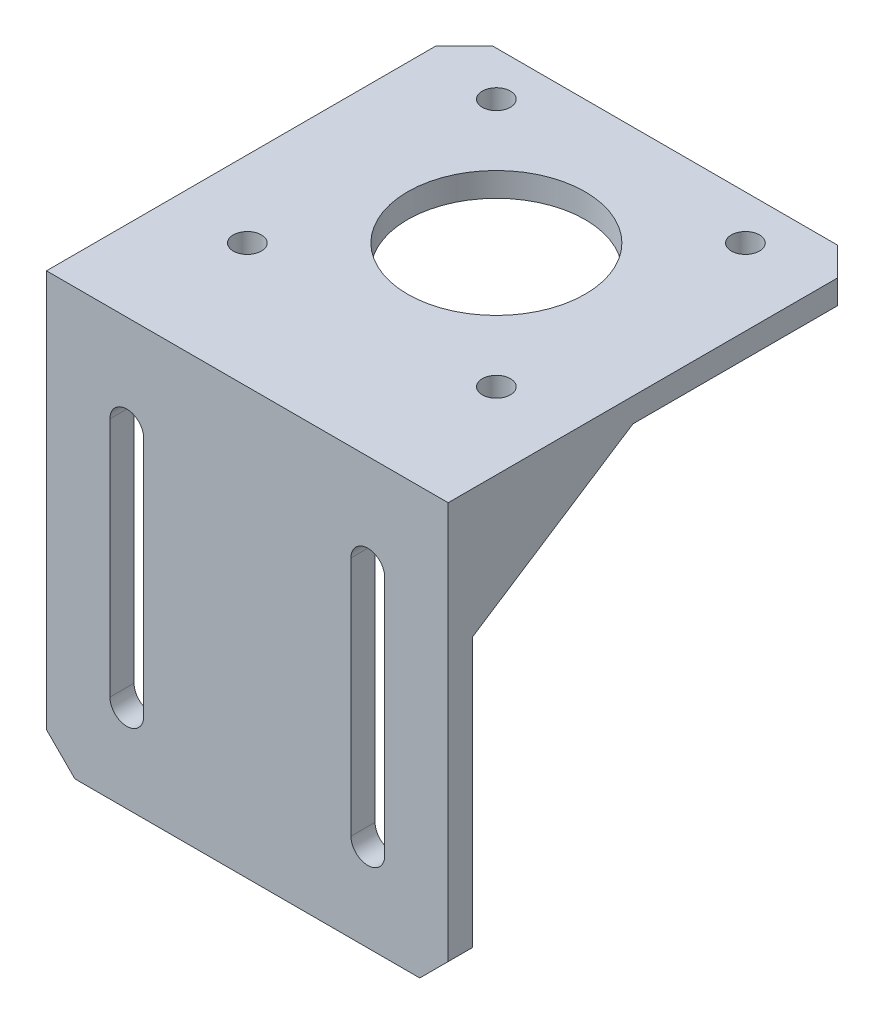
ISO-10303-21;
HEADER;
FILE_DESCRIPTION(('STEP AP214'),'2;1');
FILE_NAME('part.step','',(''),(''),'','','');
FILE_SCHEMA(('AUTOMOTIVE_DESIGN { 1 0 10303 214 1 1 1 1 }'));
ENDSEC;
DATA;
#1=APPLICATION_CONTEXT('core data for automotive mechanical design processes');
#2=APPLICATION_PROTOCOL_DEFINITION('international standard','automotive_design',2000,#1);
#3=PRODUCT_CONTEXT('',#1,'mechanical');
#4=PRODUCT('Part','Part','',(#3));
#5=PRODUCT_RELATED_PRODUCT_CATEGORY('part','',(#4));
#6=PRODUCT_DEFINITION_FORMATION('','',#4);
#7=PRODUCT_DEFINITION_CONTEXT('part definition',#1,'design');
#8=PRODUCT_DEFINITION('design','',#6,#7);
#9=PRODUCT_DEFINITION_SHAPE('','',#8);
#10=(LENGTH_UNIT() NAMED_UNIT(*) SI_UNIT(.MILLI.,.METRE.));
#11=(NAMED_UNIT(*) PLANE_ANGLE_UNIT() SI_UNIT($,.RADIAN.));
#12=(NAMED_UNIT(*) SI_UNIT($,.STERADIAN.) SOLID_ANGLE_UNIT());
#13=UNCERTAINTY_MEASURE_WITH_UNIT(LENGTH_MEASURE(1.E-05),#10,'distance_accuracy_value','');
#14=(GEOMETRIC_REPRESENTATION_CONTEXT(3) GLOBAL_UNCERTAINTY_ASSIGNED_CONTEXT((#13)) GLOBAL_UNIT_ASSIGNED_CONTEXT((#10,
#11,#12)) REPRESENTATION_CONTEXT('',''));
#15=CARTESIAN_POINT('',(0.,0.,0.));
#16=DIRECTION('',(0.,0.,1.));
#17=DIRECTION('',(1.,0.,0.));
#18=AXIS2_PLACEMENT_3D('',#15,#16,#17);
#19=CARTESIAN_POINT('',(0.,3.,0.));
#20=DIRECTION('',(0.,-1.,0.));
#21=DIRECTION('',(0.,0.,-1.));
#22=AXIS2_PLACEMENT_3D('',#19,#20,#21);
#23=PLANE('',#22);
#24=DIRECTION('',(0.,0.,1.));
#25=VECTOR('',#24,1.);
#26=CARTESIAN_POINT('',(0.,3.,0.));
#27=LINE('',#26,#25);
#28=CARTESIAN_POINT('',(0.,3.,-45.4644660940672));
#29=VERTEX_POINT('',#28);
#30=CARTESIAN_POINT('',(0.,3.,3.));
#31=VERTEX_POINT('',#30);
#32=EDGE_CURVE('E370',#29,#31,#27,.T.);
#33=ORIENTED_EDGE('',*,*,#32,.T.);
#34=DIRECTION('',(-1.,0.,0.));
#35=VECTOR('',#34,1.);
#36=CARTESIAN_POINT('',(50.,3.,3.));
#37=LINE('',#36,#35);
#38=CARTESIAN_POINT('',(50.,3.,3.));
#39=VERTEX_POINT('',#38);
#40=EDGE_CURVE('E296',#39,#31,#37,.T.);
#41=ORIENTED_EDGE('',*,*,#40,.F.);
#42=DIRECTION('',(0.,0.,-1.));
#43=VECTOR('',#42,1.);
#44=CARTESIAN_POINT('',(50.,3.,-45.4644660940672));
#45=LINE('',#44,#43);
#46=CARTESIAN_POINT('',(50.,3.,-45.4644660940672));
#47=VERTEX_POINT('',#46);
#48=EDGE_CURVE('E87',#39,#47,#45,.T.);
#49=ORIENTED_EDGE('',*,*,#48,.T.);
#50=DIRECTION('',(-0.707106781186547,0.,-0.707106781186547));
#51=VECTOR('',#50,1.);
#52=CARTESIAN_POINT('',(46.4644660940673,3.,-49.));
#53=LINE('',#52,#51);
#54=CARTESIAN_POINT('',(46.4644660940673,3.,-49.));
#55=VERTEX_POINT('',#54);
#56=EDGE_CURVE('E364',#47,#55,#53,.T.);
#57=ORIENTED_EDGE('',*,*,#56,.T.);
#58=DIRECTION('',(-1.,0.,0.));
#59=VECTOR('',#58,1.);
#60=CARTESIAN_POINT('',(3.53553390593273,3.,-49.));
#61=LINE('',#60,#59);
#62=CARTESIAN_POINT('',(3.53553390593273,3.,-49.));
#63=VERTEX_POINT('',#62);
#64=EDGE_CURVE('E367',#55,#63,#61,.T.);
#65=ORIENTED_EDGE('',*,*,#64,.T.);
#66=DIRECTION('',(-0.707106781186546,0.,0.707106781186549));
#67=VECTOR('',#66,1.);
#68=CARTESIAN_POINT('',(0.,3.,-45.4644660940672));
#69=LINE('',#68,#67);
#70=EDGE_CURVE('E59',#63,#29,#69,.T.);
#71=ORIENTED_EDGE('',*,*,#70,.T.);
#72=EDGE_LOOP('',(#33,#41,#49,#57,#65,#71));
#73=FACE_BOUND('',#72,.T.);
#74=CARTESIAN_POINT('',(25.,3.,-28.));
#75=DIRECTION('',(0.,1.,0.));
#76=DIRECTION('',(0.,0.,1.));
#77=AXIS2_PLACEMENT_3D('',#74,#75,#76);
#78=CIRCLE('',#77,11.05);
#79=CARTESIAN_POINT('',(25.,3.,-16.95));
#80=VERTEX_POINT('',#79);
#81=EDGE_CURVE('E357',#80,#80,#78,.T.);
#82=ORIENTED_EDGE('',*,*,#81,.F.);
#83=EDGE_LOOP('',(#82));
#84=FACE_BOUND('',#83,.T.);
#85=CARTESIAN_POINT('',(9.5,3.,-12.5));
#86=DIRECTION('',(0.,1.,0.));
#87=DIRECTION('',(0.,0.,1.));
#88=AXIS2_PLACEMENT_3D('',#85,#86,#87);
#89=CIRCLE('',#88,1.75);
#90=CARTESIAN_POINT('',(9.5,3.,-10.75));
#91=VERTEX_POINT('',#90);
#92=EDGE_CURVE('E351',#91,#91,#89,.T.);
#93=ORIENTED_EDGE('',*,*,#92,.F.);
#94=EDGE_LOOP('',(#93));
#95=FACE_BOUND('',#94,.T.);
#96=CARTESIAN_POINT('',(9.50000000000001,3.,-43.5));
#97=DIRECTION('',(0.,1.,0.));
#98=DIRECTION('',(0.,0.,1.));
#99=AXIS2_PLACEMENT_3D('',#96,#97,#98);
#100=CIRCLE('',#99,1.75);
#101=CARTESIAN_POINT('',(9.50000000000001,3.,-41.75));
#102=VERTEX_POINT('',#101);
#103=EDGE_CURVE('E345',#102,#102,#100,.T.);
#104=ORIENTED_EDGE('',*,*,#103,.F.);
#105=EDGE_LOOP('',(#104));
#106=FACE_BOUND('',#105,.T.);
#107=CARTESIAN_POINT('',(40.5,3.,-43.5));
#108=DIRECTION('',(0.,1.,0.));
#109=DIRECTION('',(0.,0.,1.));
#110=AXIS2_PLACEMENT_3D('',#107,#108,#109);
#111=CIRCLE('',#110,1.75);
#112=CARTESIAN_POINT('',(40.5,3.,-41.75));
#113=VERTEX_POINT('',#112);
#114=EDGE_CURVE('E339',#113,#113,#111,.T.);
#115=ORIENTED_EDGE('',*,*,#114,.F.);
#116=EDGE_LOOP('',(#115));
#117=FACE_BOUND('',#116,.T.);
#118=CARTESIAN_POINT('',(40.5,3.,-12.5));
#119=DIRECTION('',(0.,1.,0.));
#120=DIRECTION('',(0.,0.,1.));
#121=AXIS2_PLACEMENT_3D('',#118,#119,#120);
#122=CIRCLE('',#121,1.75);
#123=CARTESIAN_POINT('',(40.5,3.,-10.75));
#124=VERTEX_POINT('',#123);
#125=EDGE_CURVE('E333',#124,#124,#122,.T.);
#126=ORIENTED_EDGE('',*,*,#125,.F.);
#127=EDGE_LOOP('',(#126));
#128=FACE_BOUND('',#127,.T.);
#129=ADVANCED_FACE('F35',(#73,#84,#95,#106,#117,#128),#23,.F.);
#130=CARTESIAN_POINT('',(0.,0.,0.));
#131=DIRECTION('',(0.,-1.,0.));
#132=DIRECTION('',(0.,0.,-1.));
#133=AXIS2_PLACEMENT_3D('',#130,#131,#132);
#134=PLANE('',#133);
#135=DIRECTION('',(-1.,0.,0.));
#136=VECTOR('',#135,1.);
#137=CARTESIAN_POINT('',(3.,0.,-20.));
#138=LINE('',#137,#136);
#139=CARTESIAN_POINT('',(3.,0.,-20.));
#140=VERTEX_POINT('',#139);
#141=CARTESIAN_POINT('',(0.,0.,-20.));
#142=VERTEX_POINT('',#141);
#143=EDGE_CURVE('E207',#140,#142,#138,.T.);
#144=ORIENTED_EDGE('',*,*,#143,.T.);
#145=DIRECTION('',(0.,0.,1.));
#146=VECTOR('',#145,1.);
#147=CARTESIAN_POINT('',(0.,0.,0.));
#148=LINE('',#147,#146);
#149=CARTESIAN_POINT('',(0.,0.,-45.4644660940672));
#150=VERTEX_POINT('',#149);
#151=EDGE_CURVE('E365',#150,#142,#148,.T.);
#152=ORIENTED_EDGE('',*,*,#151,.F.);
#153=DIRECTION('',(-0.707106781186546,0.,0.707106781186549));
#154=VECTOR('',#153,1.);
#155=CARTESIAN_POINT('',(0.,0.,-45.4644660940672));
#156=LINE('',#155,#154);
#157=CARTESIAN_POINT('',(3.53553390593273,0.,-49.));
#158=VERTEX_POINT('',#157);
#159=EDGE_CURVE('E80',#158,#150,#156,.T.);
#160=ORIENTED_EDGE('',*,*,#159,.F.);
#161=DIRECTION('',(-1.,0.,0.));
#162=VECTOR('',#161,1.);
#163=CARTESIAN_POINT('',(3.53553390593273,0.,-49.));
#164=LINE('',#163,#162);
#165=CARTESIAN_POINT('',(46.4644660940673,0.,-49.));
#166=VERTEX_POINT('',#165);
#167=EDGE_CURVE('E378',#166,#158,#164,.T.);
#168=ORIENTED_EDGE('',*,*,#167,.F.);
#169=DIRECTION('',(-0.707106781186547,0.,-0.707106781186547));
#170=VECTOR('',#169,1.);
#171=CARTESIAN_POINT('',(46.4644660940673,0.,-49.));
#172=LINE('',#171,#170);
#173=CARTESIAN_POINT('',(50.,0.,-45.4644660940672));
#174=VERTEX_POINT('',#173);
#175=EDGE_CURVE('E376',#174,#166,#172,.T.);
#176=ORIENTED_EDGE('',*,*,#175,.F.);
#177=DIRECTION('',(0.,0.,-1.));
#178=VECTOR('',#177,1.);
#179=CARTESIAN_POINT('',(50.,0.,-45.4644660940672));
#180=LINE('',#179,#178);
#181=CARTESIAN_POINT('',(50.,0.,-20.));
#182=VERTEX_POINT('',#181);
#183=EDGE_CURVE('E374',#182,#174,#180,.T.);
#184=ORIENTED_EDGE('',*,*,#183,.F.);
#185=DIRECTION('',(1.,0.,0.));
#186=VECTOR('',#185,1.);
#187=CARTESIAN_POINT('',(47.,0.,-20.));
#188=LINE('',#187,#186);
#189=CARTESIAN_POINT('',(47.,0.,-20.));
#190=VERTEX_POINT('',#189);
#191=EDGE_CURVE('E230',#190,#182,#188,.T.);
#192=ORIENTED_EDGE('',*,*,#191,.F.);
#193=DIRECTION('',(0.,0.,1.));
#194=VECTOR('',#193,1.);
#195=CARTESIAN_POINT('',(47.,0.,-20.));
#196=LINE('',#195,#194);
#197=CARTESIAN_POINT('',(47.,0.,0.));
#198=VERTEX_POINT('',#197);
#199=EDGE_CURVE('E218',#190,#198,#196,.T.);
#200=ORIENTED_EDGE('',*,*,#199,.T.);
#201=DIRECTION('',(1.,0.,0.));
#202=VECTOR('',#201,1.);
#203=CARTESIAN_POINT('',(50.,0.,0.));
#204=LINE('',#203,#202);
#205=CARTESIAN_POINT('',(3.,0.,0.));
#206=VERTEX_POINT('',#205);
#207=EDGE_CURVE('E360',#206,#198,#204,.T.);
#208=ORIENTED_EDGE('',*,*,#207,.F.);
#209=DIRECTION('',(0.,0.,-1.));
#210=VECTOR('',#209,1.);
#211=CARTESIAN_POINT('',(3.,0.,-20.));
#212=LINE('',#211,#210);
#213=EDGE_CURVE('E197',#206,#140,#212,.T.);
#214=ORIENTED_EDGE('',*,*,#213,.T.);
#215=EDGE_LOOP('',(#144,#152,#160,#168,#176,#184,#192,#200,#208,#214));
#216=FACE_BOUND('',#215,.T.);
#217=CARTESIAN_POINT('',(40.5,0.,-43.5));
#218=DIRECTION('',(0.,1.,0.));
#219=DIRECTION('',(0.,0.,1.));
#220=AXIS2_PLACEMENT_3D('',#217,#218,#219);
#221=CIRCLE('',#220,1.75);
#222=CARTESIAN_POINT('',(40.5,0.,-41.75));
#223=VERTEX_POINT('',#222);
#224=EDGE_CURVE('E336',#223,#223,#221,.T.);
#225=ORIENTED_EDGE('',*,*,#224,.T.);
#226=EDGE_LOOP('',(#225));
#227=FACE_BOUND('',#226,.T.);
#228=CARTESIAN_POINT('',(9.5,0.,-12.5));
#229=DIRECTION('',(0.,1.,0.));
#230=DIRECTION('',(0.,0.,1.));
#231=AXIS2_PLACEMENT_3D('',#228,#229,#230);
#232=CIRCLE('',#231,1.75);
#233=CARTESIAN_POINT('',(9.5,0.,-10.75));
#234=VERTEX_POINT('',#233);
#235=EDGE_CURVE('E348',#234,#234,#232,.T.);
#236=ORIENTED_EDGE('',*,*,#235,.T.);
#237=EDGE_LOOP('',(#236));
#238=FACE_BOUND('',#237,.T.);
#239=CARTESIAN_POINT('',(25.,0.,-28.));
#240=DIRECTION('',(0.,1.,0.));
#241=DIRECTION('',(0.,0.,1.));
#242=AXIS2_PLACEMENT_3D('',#239,#240,#241);
#243=CIRCLE('',#242,11.05);
#244=CARTESIAN_POINT('',(25.,0.,-16.95));
#245=VERTEX_POINT('',#244);
#246=EDGE_CURVE('E354',#245,#245,#243,.T.);
#247=ORIENTED_EDGE('',*,*,#246,.T.);
#248=EDGE_LOOP('',(#247));
#249=FACE_BOUND('',#248,.T.);
#250=CARTESIAN_POINT('',(9.50000000000001,0.,-43.5));
#251=DIRECTION('',(0.,1.,0.));
#252=DIRECTION('',(0.,0.,1.));
#253=AXIS2_PLACEMENT_3D('',#250,#251,#252);
#254=CIRCLE('',#253,1.75);
#255=CARTESIAN_POINT('',(9.50000000000001,0.,-41.75));
#256=VERTEX_POINT('',#255);
#257=EDGE_CURVE('E342',#256,#256,#254,.T.);
#258=ORIENTED_EDGE('',*,*,#257,.T.);
#259=EDGE_LOOP('',(#258));
#260=FACE_BOUND('',#259,.T.);
#261=CARTESIAN_POINT('',(40.5,0.,-12.5));
#262=DIRECTION('',(0.,1.,0.));
#263=DIRECTION('',(0.,0.,1.));
#264=AXIS2_PLACEMENT_3D('',#261,#262,#263);
#265=CIRCLE('',#264,1.75);
#266=CARTESIAN_POINT('',(40.5,0.,-10.75));
#267=VERTEX_POINT('',#266);
#268=EDGE_CURVE('E332',#267,#267,#265,.T.);
#269=ORIENTED_EDGE('',*,*,#268,.T.);
#270=EDGE_LOOP('',(#269));
#271=FACE_BOUND('',#270,.T.);
#272=ADVANCED_FACE('F395',(#216,#227,#238,#249,#260,#271),#134,.T.);
#273=CARTESIAN_POINT('',(50.,3.,-45.4644660940672));
#274=DIRECTION('',(-1.,0.,0.));
#275=DIRECTION('',(0.,0.,1.));
#276=AXIS2_PLACEMENT_3D('',#273,#274,#275);
#277=PLANE('',#276);
#278=DIRECTION('',(0.,0.544988350595414,-0.838443616300637));
#279=VECTOR('',#278,1.);
#280=CARTESIAN_POINT('',(50.,-13.,0.));
#281=LINE('',#280,#279);
#282=CARTESIAN_POINT('',(50.,-13.,0.));
#283=VERTEX_POINT('',#282);
#284=EDGE_CURVE('E213',#283,#182,#281,.T.);
#285=ORIENTED_EDGE('',*,*,#284,.T.);
#286=ORIENTED_EDGE('',*,*,#183,.T.);
#287=DIRECTION('',(0.,-1.,0.));
#288=VECTOR('',#287,1.);
#289=CARTESIAN_POINT('',(50.,3.,-45.4644660940672));
#290=LINE('',#289,#288);
#291=EDGE_CURVE('E11',#47,#174,#290,.T.);
#292=ORIENTED_EDGE('',*,*,#291,.F.);
#293=ORIENTED_EDGE('',*,*,#48,.F.);
#294=DIRECTION('',(0.,1.,0.));
#295=VECTOR('',#294,1.);
#296=CARTESIAN_POINT('',(50.,-46.4644660940673,3.));
#297=LINE('',#296,#295);
#298=CARTESIAN_POINT('',(50.,-46.4644660940673,3.));
#299=VERTEX_POINT('',#298);
#300=EDGE_CURVE('E308',#299,#39,#297,.T.);
#301=ORIENTED_EDGE('',*,*,#300,.F.);
#302=DIRECTION('',(0.,0.,-1.));
#303=VECTOR('',#302,1.);
#304=CARTESIAN_POINT('',(50.,-46.4644660940673,3.));
#305=LINE('',#304,#303);
#306=CARTESIAN_POINT('',(50.,-46.4644660940673,0.));
#307=VERTEX_POINT('',#306);
#308=EDGE_CURVE('E311',#299,#307,#305,.T.);
#309=ORIENTED_EDGE('',*,*,#308,.T.);
#310=DIRECTION('',(0.,1.,0.));
#311=VECTOR('',#310,1.);
#312=CARTESIAN_POINT('',(50.,-46.4644660940673,0.));
#313=LINE('',#312,#311);
#314=EDGE_CURVE('E300',#307,#283,#313,.T.);
#315=ORIENTED_EDGE('',*,*,#314,.T.);
#316=EDGE_LOOP('',(#285,#286,#292,#293,#301,#309,#315));
#317=FACE_BOUND('',#316,.T.);
#318=ADVANCED_FACE('F37',(#317),#277,.F.);
#319=CARTESIAN_POINT('',(46.4644660940673,3.,-49.));
#320=DIRECTION('',(-0.707106781186548,0.,0.707106781186548));
#321=DIRECTION('',(0.707106781186548,0.,0.707106781186548));
#322=AXIS2_PLACEMENT_3D('',#319,#320,#321);
#323=PLANE('',#322);
#324=ORIENTED_EDGE('',*,*,#175,.T.);
#325=DIRECTION('',(0.,-1.,0.));
#326=VECTOR('',#325,1.);
#327=CARTESIAN_POINT('',(46.4644660940673,3.,-49.));
#328=LINE('',#327,#326);
#329=EDGE_CURVE('E43',#55,#166,#328,.T.);
#330=ORIENTED_EDGE('',*,*,#329,.F.);
#331=ORIENTED_EDGE('',*,*,#56,.F.);
#332=ORIENTED_EDGE('',*,*,#291,.T.);
#333=EDGE_LOOP('',(#324,#330,#331,#332));
#334=FACE_BOUND('',#333,.T.);
#335=ADVANCED_FACE('F411',(#334),#323,.F.);
#336=CARTESIAN_POINT('',(3.53553390593273,3.,-49.));
#337=DIRECTION('',(0.,0.,1.));
#338=DIRECTION('',(1.,0.,0.));
#339=AXIS2_PLACEMENT_3D('',#336,#337,#338);
#340=PLANE('',#339);
#341=ORIENTED_EDGE('',*,*,#167,.T.);
#342=DIRECTION('',(0.,-1.,0.));
#343=VECTOR('',#342,1.);
#344=CARTESIAN_POINT('',(3.53553390593273,3.,-49.));
#345=LINE('',#344,#343);
#346=EDGE_CURVE('E383',#63,#158,#345,.T.);
#347=ORIENTED_EDGE('',*,*,#346,.F.);
#348=ORIENTED_EDGE('',*,*,#64,.F.);
#349=ORIENTED_EDGE('',*,*,#329,.T.);
#350=EDGE_LOOP('',(#341,#347,#348,#349));
#351=FACE_BOUND('',#350,.T.);
#352=ADVANCED_FACE('F389',(#351),#340,.F.);
#353=CARTESIAN_POINT('',(0.,3.,-45.4644660940672));
#354=DIRECTION('',(0.707106781186549,0.,0.707106781186546));
#355=DIRECTION('',(0.707106781186546,0.,-0.707106781186549));
#356=AXIS2_PLACEMENT_3D('',#353,#354,#355);
#357=PLANE('',#356);
#358=ORIENTED_EDGE('',*,*,#159,.T.);
#359=DIRECTION('',(0.,-1.,0.));
#360=VECTOR('',#359,1.);
#361=CARTESIAN_POINT('',(0.,3.,-45.4644660940672));
#362=LINE('',#361,#360);
#363=EDGE_CURVE('E372',#29,#150,#362,.T.);
#364=ORIENTED_EDGE('',*,*,#363,.F.);
#365=ORIENTED_EDGE('',*,*,#70,.F.);
#366=ORIENTED_EDGE('',*,*,#346,.T.);
#367=EDGE_LOOP('',(#358,#364,#365,#366));
#368=FACE_BOUND('',#367,.T.);
#369=ADVANCED_FACE('F402',(#368),#357,.F.);
#370=CARTESIAN_POINT('',(0.,3.,0.));
#371=DIRECTION('',(1.,0.,0.));
#372=DIRECTION('',(0.,0.,-1.));
#373=AXIS2_PLACEMENT_3D('',#370,#371,#372);
#374=PLANE('',#373);
#375=ORIENTED_EDGE('',*,*,#151,.T.);
#376=DIRECTION('',(0.,-0.544988350595414,0.838443616300637));
#377=VECTOR('',#376,1.);
#378=CARTESIAN_POINT('',(0.,-13.,0.));
#379=LINE('',#378,#377);
#380=CARTESIAN_POINT('',(0.,-13.,0.));
#381=VERTEX_POINT('',#380);
#382=EDGE_CURVE('E50',#142,#381,#379,.T.);
#383=ORIENTED_EDGE('',*,*,#382,.T.);
#384=DIRECTION('',(0.,-1.,0.));
#385=VECTOR('',#384,1.);
#386=CARTESIAN_POINT('',(0.,3.,0.));
#387=LINE('',#386,#385);
#388=CARTESIAN_POINT('',(0.,-46.4644660940673,0.));
#389=VERTEX_POINT('',#388);
#390=EDGE_CURVE('E211',#381,#389,#387,.T.);
#391=ORIENTED_EDGE('',*,*,#390,.T.);
#392=DIRECTION('',(0.,0.,-1.));
#393=VECTOR('',#392,1.);
#394=CARTESIAN_POINT('',(0.,-46.4644660940673,3.));
#395=LINE('',#394,#393);
#396=CARTESIAN_POINT('',(0.,-46.4644660940673,3.));
#397=VERTEX_POINT('',#396);
#398=EDGE_CURVE('E329',#397,#389,#395,.T.);
#399=ORIENTED_EDGE('',*,*,#398,.F.);
#400=DIRECTION('',(0.,-1.,0.));
#401=VECTOR('',#400,1.);
#402=CARTESIAN_POINT('',(0.,3.,3.));
#403=LINE('',#402,#401);
#404=EDGE_CURVE('E299',#31,#397,#403,.T.);
#405=ORIENTED_EDGE('',*,*,#404,.F.);
#406=ORIENTED_EDGE('',*,*,#32,.F.);
#407=ORIENTED_EDGE('',*,*,#363,.T.);
#408=EDGE_LOOP('',(#375,#383,#391,#399,#405,#406,#407));
#409=FACE_BOUND('',#408,.T.);
#410=ADVANCED_FACE('F399',(#409),#374,.F.);
#411=CARTESIAN_POINT('',(25.,3.,-28.));
#412=DIRECTION('',(0.,-1.,0.));
#413=DIRECTION('',(0.,0.,-1.));
#414=AXIS2_PLACEMENT_3D('',#411,#412,#413);
#415=CYLINDRICAL_SURFACE('',#414,11.05);
#416=ORIENTED_EDGE('',*,*,#81,.T.);
#417=EDGE_LOOP('',(#416));
#418=FACE_BOUND('',#417,.T.);
#419=ORIENTED_EDGE('',*,*,#246,.F.);
#420=EDGE_LOOP('',(#419));
#421=FACE_BOUND('',#420,.T.);
#422=ADVANCED_FACE('F409',(#418,#421),#415,.F.);
#423=CARTESIAN_POINT('',(9.5,3.,-12.5));
#424=DIRECTION('',(0.,-1.,0.));
#425=DIRECTION('',(0.,0.,-1.));
#426=AXIS2_PLACEMENT_3D('',#423,#424,#425);
#427=CYLINDRICAL_SURFACE('',#426,1.75);
#428=ORIENTED_EDGE('',*,*,#92,.T.);
#429=EDGE_LOOP('',(#428));
#430=FACE_BOUND('',#429,.T.);
#431=ORIENTED_EDGE('',*,*,#235,.F.);
#432=EDGE_LOOP('',(#431));
#433=FACE_BOUND('',#432,.T.);
#434=ADVANCED_FACE('F423',(#430,#433),#427,.F.);
#435=CARTESIAN_POINT('',(9.50000000000001,3.,-43.5));
#436=DIRECTION('',(0.,-1.,0.));
#437=DIRECTION('',(0.,0.,-1.));
#438=AXIS2_PLACEMENT_3D('',#435,#436,#437);
#439=CYLINDRICAL_SURFACE('',#438,1.75);
#440=ORIENTED_EDGE('',*,*,#103,.T.);
#441=EDGE_LOOP('',(#440));
#442=FACE_BOUND('',#441,.T.);
#443=ORIENTED_EDGE('',*,*,#257,.F.);
#444=EDGE_LOOP('',(#443));
#445=FACE_BOUND('',#444,.T.);
#446=ADVANCED_FACE('F427',(#442,#445),#439,.F.);
#447=CARTESIAN_POINT('',(40.5,3.,-43.5));
#448=DIRECTION('',(0.,-1.,0.));
#449=DIRECTION('',(0.,0.,-1.));
#450=AXIS2_PLACEMENT_3D('',#447,#448,#449);
#451=CYLINDRICAL_SURFACE('',#450,1.75);
#452=ORIENTED_EDGE('',*,*,#114,.T.);
#453=EDGE_LOOP('',(#452));
#454=FACE_BOUND('',#453,.T.);
#455=ORIENTED_EDGE('',*,*,#224,.F.);
#456=EDGE_LOOP('',(#455));
#457=FACE_BOUND('',#456,.T.);
#458=ADVANCED_FACE('F431',(#454,#457),#451,.F.);
#459=CARTESIAN_POINT('',(40.5,3.,-12.5));
#460=DIRECTION('',(0.,-1.,0.));
#461=DIRECTION('',(0.,0.,-1.));
#462=AXIS2_PLACEMENT_3D('',#459,#460,#461);
#463=CYLINDRICAL_SURFACE('',#462,1.75);
#464=ORIENTED_EDGE('',*,*,#125,.T.);
#465=EDGE_LOOP('',(#464));
#466=FACE_BOUND('',#465,.T.);
#467=ORIENTED_EDGE('',*,*,#268,.F.);
#468=EDGE_LOOP('',(#467));
#469=FACE_BOUND('',#468,.T.);
#470=ADVANCED_FACE('F435',(#466,#469),#463,.F.);
#471=CARTESIAN_POINT('',(0.,0.,0.));
#472=DIRECTION('',(0.,0.,1.));
#473=DIRECTION('',(1.,0.,0.));
#474=AXIS2_PLACEMENT_3D('',#471,#472,#473);
#475=PLANE('',#474);
#476=CARTESIAN_POINT('',(10.,-9.00000000000001,0.));
#477=DIRECTION('',(0.,0.,1.));
#478=DIRECTION('',(1.,0.,0.));
#479=AXIS2_PLACEMENT_3D('',#476,#477,#478);
#480=CIRCLE('',#479,2.09999999999999);
#481=CARTESIAN_POINT('',(12.1,-9.00000000000001,0.));
#482=VERTEX_POINT('',#481);
#483=CARTESIAN_POINT('',(7.90000000000001,-9.00000000000001,0.));
#484=VERTEX_POINT('',#483);
#485=EDGE_CURVE('E265',#482,#484,#480,.T.);
#486=ORIENTED_EDGE('',*,*,#485,.T.);
#487=DIRECTION('',(0.,-1.,0.));
#488=VECTOR('',#487,1.);
#489=CARTESIAN_POINT('',(7.90000000000001,-9.00000000000001,0.));
#490=LINE('',#489,#488);
#491=CARTESIAN_POINT('',(7.90000000000001,-39.,0.));
#492=VERTEX_POINT('',#491);
#493=EDGE_CURVE('E279',#484,#492,#490,.T.);
#494=ORIENTED_EDGE('',*,*,#493,.T.);
#495=CARTESIAN_POINT('',(10.,-39.,0.));
#496=DIRECTION('',(0.,0.,1.));
#497=DIRECTION('',(1.,0.,0.));
#498=AXIS2_PLACEMENT_3D('',#495,#496,#497);
#499=CIRCLE('',#498,2.09999999999999);
#500=CARTESIAN_POINT('',(12.1,-39.,0.));
#501=VERTEX_POINT('',#500);
#502=EDGE_CURVE('E282',#492,#501,#499,.T.);
#503=ORIENTED_EDGE('',*,*,#502,.T.);
#504=DIRECTION('',(0.,1.,0.));
#505=VECTOR('',#504,1.);
#506=CARTESIAN_POINT('',(12.1,-9.00000000000001,0.));
#507=LINE('',#506,#505);
#508=EDGE_CURVE('E269',#501,#482,#507,.T.);
#509=ORIENTED_EDGE('',*,*,#508,.T.);
#510=EDGE_LOOP('',(#486,#494,#503,#509));
#511=FACE_BOUND('',#510,.T.);
#512=CARTESIAN_POINT('',(40.,-9.00000000000001,0.));
#513=DIRECTION('',(0.,0.,1.));
#514=DIRECTION('',(-1.,0.,0.));
#515=AXIS2_PLACEMENT_3D('',#512,#513,#514);
#516=CIRCLE('',#515,2.09999999999999);
#517=CARTESIAN_POINT('',(42.1,-9.00000000000001,0.));
#518=VERTEX_POINT('',#517);
#519=CARTESIAN_POINT('',(37.9,-9.00000000000001,0.));
#520=VERTEX_POINT('',#519);
#521=EDGE_CURVE('E232',#518,#520,#516,.T.);
#522=ORIENTED_EDGE('',*,*,#521,.T.);
#523=DIRECTION('',(0.,-1.,0.));
#524=VECTOR('',#523,1.);
#525=CARTESIAN_POINT('',(37.9,-9.00000000000001,0.));
#526=LINE('',#525,#524);
#527=CARTESIAN_POINT('',(37.9,-39.,0.));
#528=VERTEX_POINT('',#527);
#529=EDGE_CURVE('E248',#520,#528,#526,.T.);
#530=ORIENTED_EDGE('',*,*,#529,.T.);
#531=CARTESIAN_POINT('',(40.,-39.,0.));
#532=DIRECTION('',(0.,0.,1.));
#533=DIRECTION('',(-1.,0.,0.));
#534=AXIS2_PLACEMENT_3D('',#531,#532,#533);
#535=CIRCLE('',#534,2.09999999999999);
#536=CARTESIAN_POINT('',(42.1,-39.,0.));
#537=VERTEX_POINT('',#536);
#538=EDGE_CURVE('E251',#528,#537,#535,.T.);
#539=ORIENTED_EDGE('',*,*,#538,.T.);
#540=DIRECTION('',(0.,1.,0.));
#541=VECTOR('',#540,1.);
#542=CARTESIAN_POINT('',(42.1,-9.00000000000001,0.));
#543=LINE('',#542,#541);
#544=EDGE_CURVE('E238',#537,#518,#543,.T.);
#545=ORIENTED_EDGE('',*,*,#544,.T.);
#546=EDGE_LOOP('',(#522,#530,#539,#545));
#547=FACE_BOUND('',#546,.T.);
#548=ORIENTED_EDGE('',*,*,#390,.F.);
#549=DIRECTION('',(-1.,0.,0.));
#550=VECTOR('',#549,1.);
#551=CARTESIAN_POINT('',(3.,-13.,0.));
#552=LINE('',#551,#550);
#553=CARTESIAN_POINT('',(3.,-13.,0.));
#554=VERTEX_POINT('',#553);
#555=EDGE_CURVE('E204',#554,#381,#552,.T.);
#556=ORIENTED_EDGE('',*,*,#555,.F.);
#557=DIRECTION('',(0.,1.,0.));
#558=VECTOR('',#557,1.);
#559=CARTESIAN_POINT('',(3.,0.,0.));
#560=LINE('',#559,#558);
#561=EDGE_CURVE('E192',#554,#206,#560,.T.);
#562=ORIENTED_EDGE('',*,*,#561,.T.);
#563=ORIENTED_EDGE('',*,*,#207,.T.);
#564=DIRECTION('',(0.,-1.,0.));
#565=VECTOR('',#564,1.);
#566=CARTESIAN_POINT('',(47.,0.,0.));
#567=LINE('',#566,#565);
#568=CARTESIAN_POINT('',(47.,-13.,0.));
#569=VERTEX_POINT('',#568);
#570=EDGE_CURVE('E221',#198,#569,#567,.T.);
#571=ORIENTED_EDGE('',*,*,#570,.T.);
#572=DIRECTION('',(1.,0.,0.));
#573=VECTOR('',#572,1.);
#574=CARTESIAN_POINT('',(47.,-13.,0.));
#575=LINE('',#574,#573);
#576=EDGE_CURVE('E227',#569,#283,#575,.T.);
#577=ORIENTED_EDGE('',*,*,#576,.T.);
#578=ORIENTED_EDGE('',*,*,#314,.F.);
#579=DIRECTION('',(0.707106781186546,0.707106781186549,0.));
#580=VECTOR('',#579,1.);
#581=CARTESIAN_POINT('',(46.4644660940673,-50.,0.));
#582=LINE('',#581,#580);
#583=CARTESIAN_POINT('',(46.4644660940673,-50.,0.));
#584=VERTEX_POINT('',#583);
#585=EDGE_CURVE('E317',#584,#307,#582,.T.);
#586=ORIENTED_EDGE('',*,*,#585,.F.);
#587=DIRECTION('',(1.,0.,0.));
#588=VECTOR('',#587,1.);
#589=CARTESIAN_POINT('',(3.53553390593273,-50.,0.));
#590=LINE('',#589,#588);
#591=CARTESIAN_POINT('',(3.53553390593273,-50.,0.));
#592=VERTEX_POINT('',#591);
#593=EDGE_CURVE('E315',#592,#584,#590,.T.);
#594=ORIENTED_EDGE('',*,*,#593,.F.);
#595=DIRECTION('',(0.707106781186546,-0.707106781186549,0.));
#596=VECTOR('',#595,1.);
#597=CARTESIAN_POINT('',(0.,-46.4644660940673,0.));
#598=LINE('',#597,#596);
#599=EDGE_CURVE('E313',#389,#592,#598,.T.);
#600=ORIENTED_EDGE('',*,*,#599,.F.);
#601=EDGE_LOOP('',(#548,#556,#562,#563,#571,#577,#578,#586,#594,#600));
#602=FACE_BOUND('',#601,.T.);
#603=ADVANCED_FACE('F209',(#511,#547,#602),#475,.F.);
#604=CARTESIAN_POINT('',(0.,0.,3.));
#605=DIRECTION('',(0.,0.,1.));
#606=DIRECTION('',(1.,0.,0.));
#607=AXIS2_PLACEMENT_3D('',#604,#605,#606);
#608=PLANE('',#607);
#609=ORIENTED_EDGE('',*,*,#40,.T.);
#610=ORIENTED_EDGE('',*,*,#404,.T.);
#611=DIRECTION('',(0.707106781186546,-0.707106781186549,0.));
#612=VECTOR('',#611,1.);
#613=CARTESIAN_POINT('',(0.,-46.4644660940673,3.));
#614=LINE('',#613,#612);
#615=CARTESIAN_POINT('',(3.53553390593273,-50.,3.));
#616=VERTEX_POINT('',#615);
#617=EDGE_CURVE('E302',#397,#616,#614,.T.);
#618=ORIENTED_EDGE('',*,*,#617,.T.);
#619=DIRECTION('',(1.,0.,0.));
#620=VECTOR('',#619,1.);
#621=CARTESIAN_POINT('',(3.53553390593273,-50.,3.));
#622=LINE('',#621,#620);
#623=CARTESIAN_POINT('',(46.4644660940673,-50.,3.));
#624=VERTEX_POINT('',#623);
#625=EDGE_CURVE('E304',#616,#624,#622,.T.);
#626=ORIENTED_EDGE('',*,*,#625,.T.);
#627=DIRECTION('',(0.707106781186546,0.707106781186549,0.));
#628=VECTOR('',#627,1.);
#629=CARTESIAN_POINT('',(46.4644660940673,-50.,3.));
#630=LINE('',#629,#628);
#631=EDGE_CURVE('E306',#624,#299,#630,.T.);
#632=ORIENTED_EDGE('',*,*,#631,.T.);
#633=ORIENTED_EDGE('',*,*,#300,.T.);
#634=EDGE_LOOP('',(#609,#610,#618,#626,#632,#633));
#635=FACE_BOUND('',#634,.T.);
#636=DIRECTION('',(0.,-1.,0.));
#637=VECTOR('',#636,1.);
#638=CARTESIAN_POINT('',(7.90000000000001,-9.00000000000001,3.));
#639=LINE('',#638,#637);
#640=CARTESIAN_POINT('',(7.90000000000001,-9.00000000000001,3.));
#641=VERTEX_POINT('',#640);
#642=CARTESIAN_POINT('',(7.90000000000001,-39.,3.));
#643=VERTEX_POINT('',#642);
#644=EDGE_CURVE('E268',#641,#643,#639,.T.);
#645=ORIENTED_EDGE('',*,*,#644,.F.);
#646=CARTESIAN_POINT('',(10.,-9.00000000000001,3.));
#647=DIRECTION('',(0.,0.,1.));
#648=DIRECTION('',(1.,0.,0.));
#649=AXIS2_PLACEMENT_3D('',#646,#647,#648);
#650=CIRCLE('',#649,2.09999999999999);
#651=CARTESIAN_POINT('',(12.1,-9.00000000000001,3.));
#652=VERTEX_POINT('',#651);
#653=EDGE_CURVE('E266',#652,#641,#650,.T.);
#654=ORIENTED_EDGE('',*,*,#653,.F.);
#655=DIRECTION('',(0.,1.,0.));
#656=VECTOR('',#655,1.);
#657=CARTESIAN_POINT('',(12.1,-9.00000000000001,3.));
#658=LINE('',#657,#656);
#659=CARTESIAN_POINT('',(12.1,-39.,3.));
#660=VERTEX_POINT('',#659);
#661=EDGE_CURVE('E274',#660,#652,#658,.T.);
#662=ORIENTED_EDGE('',*,*,#661,.F.);
#663=CARTESIAN_POINT('',(10.,-39.,3.));
#664=DIRECTION('',(0.,0.,1.));
#665=DIRECTION('',(1.,0.,0.));
#666=AXIS2_PLACEMENT_3D('',#663,#664,#665);
#667=CIRCLE('',#666,2.09999999999999);
#668=EDGE_CURVE('E271',#643,#660,#667,.T.);
#669=ORIENTED_EDGE('',*,*,#668,.F.);
#670=EDGE_LOOP('',(#645,#654,#662,#669));
#671=FACE_BOUND('',#670,.T.);
#672=DIRECTION('',(0.,-1.,0.));
#673=VECTOR('',#672,1.);
#674=CARTESIAN_POINT('',(37.9,-9.00000000000001,3.));
#675=LINE('',#674,#673);
#676=CARTESIAN_POINT('',(37.9,-9.00000000000001,3.));
#677=VERTEX_POINT('',#676);
#678=CARTESIAN_POINT('',(37.9,-39.,3.));
#679=VERTEX_POINT('',#678);
#680=EDGE_CURVE('E237',#677,#679,#675,.T.);
#681=ORIENTED_EDGE('',*,*,#680,.F.);
#682=CARTESIAN_POINT('',(40.,-9.00000000000001,3.));
#683=DIRECTION('',(0.,0.,1.));
#684=DIRECTION('',(-1.,0.,0.));
#685=AXIS2_PLACEMENT_3D('',#682,#683,#684);
#686=CIRCLE('',#685,2.09999999999999);
#687=CARTESIAN_POINT('',(42.1,-9.00000000000001,3.));
#688=VERTEX_POINT('',#687);
#689=EDGE_CURVE('E235',#688,#677,#686,.T.);
#690=ORIENTED_EDGE('',*,*,#689,.F.);
#691=DIRECTION('',(0.,1.,0.));
#692=VECTOR('',#691,1.);
#693=CARTESIAN_POINT('',(42.1,-9.00000000000001,3.));
#694=LINE('',#693,#692);
#695=CARTESIAN_POINT('',(42.1,-39.,3.));
#696=VERTEX_POINT('',#695);
#697=EDGE_CURVE('E243',#696,#688,#694,.T.);
#698=ORIENTED_EDGE('',*,*,#697,.F.);
#699=CARTESIAN_POINT('',(40.,-39.,3.));
#700=DIRECTION('',(0.,0.,1.));
#701=DIRECTION('',(-1.,0.,0.));
#702=AXIS2_PLACEMENT_3D('',#699,#700,#701);
#703=CIRCLE('',#702,2.09999999999999);
#704=EDGE_CURVE('E240',#679,#696,#703,.T.);
#705=ORIENTED_EDGE('',*,*,#704,.F.);
#706=EDGE_LOOP('',(#681,#690,#698,#705));
#707=FACE_BOUND('',#706,.T.);
#708=ADVANCED_FACE('F444',(#635,#671,#707),#608,.T.);
#709=CARTESIAN_POINT('',(0.,-46.4644660940673,3.));
#710=DIRECTION('',(0.707106781186549,0.707106781186546,0.));
#711=DIRECTION('',(-0.707106781186546,0.707106781186549,0.));
#712=AXIS2_PLACEMENT_3D('',#709,#710,#711);
#713=PLANE('',#712);
#714=ORIENTED_EDGE('',*,*,#599,.T.);
#715=DIRECTION('',(0.,0.,-1.));
#716=VECTOR('',#715,1.);
#717=CARTESIAN_POINT('',(3.53553390593273,-50.,3.));
#718=LINE('',#717,#716);
#719=EDGE_CURVE('E326',#616,#592,#718,.T.);
#720=ORIENTED_EDGE('',*,*,#719,.F.);
#721=ORIENTED_EDGE('',*,*,#617,.F.);
#722=ORIENTED_EDGE('',*,*,#398,.T.);
#723=EDGE_LOOP('',(#714,#720,#721,#722));
#724=FACE_BOUND('',#723,.T.);
#725=ADVANCED_FACE('F440',(#724),#713,.F.);
#726=CARTESIAN_POINT('',(3.53553390593273,-50.,3.));
#727=DIRECTION('',(0.,1.,0.));
#728=DIRECTION('',(0.,0.,1.));
#729=AXIS2_PLACEMENT_3D('',#726,#727,#728);
#730=PLANE('',#729);
#731=ORIENTED_EDGE('',*,*,#593,.T.);
#732=DIRECTION('',(0.,0.,-1.));
#733=VECTOR('',#732,1.);
#734=CARTESIAN_POINT('',(46.4644660940673,-50.,3.));
#735=LINE('',#734,#733);
#736=EDGE_CURVE('E323',#624,#584,#735,.T.);
#737=ORIENTED_EDGE('',*,*,#736,.F.);
#738=ORIENTED_EDGE('',*,*,#625,.F.);
#739=ORIENTED_EDGE('',*,*,#719,.T.);
#740=EDGE_LOOP('',(#731,#737,#738,#739));
#741=FACE_BOUND('',#740,.T.);
#742=ADVANCED_FACE('F443',(#741),#730,.F.);
#743=CARTESIAN_POINT('',(46.4644660940673,-50.,3.));
#744=DIRECTION('',(-0.707106781186549,0.707106781186546,0.));
#745=DIRECTION('',(-0.707106781186546,-0.707106781186549,0.));
#746=AXIS2_PLACEMENT_3D('',#743,#744,#745);
#747=PLANE('',#746);
#748=ORIENTED_EDGE('',*,*,#585,.T.);
#749=ORIENTED_EDGE('',*,*,#308,.F.);
#750=ORIENTED_EDGE('',*,*,#631,.F.);
#751=ORIENTED_EDGE('',*,*,#736,.T.);
#752=EDGE_LOOP('',(#748,#749,#750,#751));
#753=FACE_BOUND('',#752,.T.);
#754=ADVANCED_FACE('F448',(#753),#747,.F.);
#755=CARTESIAN_POINT('',(10.,-9.00000000000001,3.));
#756=DIRECTION('',(0.,0.,-1.));
#757=DIRECTION('',(-1.,0.,0.));
#758=AXIS2_PLACEMENT_3D('',#755,#756,#757);
#759=CYLINDRICAL_SURFACE('',#758,2.09999999999999);
#760=ORIENTED_EDGE('',*,*,#485,.F.);
#761=DIRECTION('',(0.,0.,-1.));
#762=VECTOR('',#761,1.);
#763=CARTESIAN_POINT('',(12.1,-9.00000000000001,3.));
#764=LINE('',#763,#762);
#765=EDGE_CURVE('E276',#652,#482,#764,.T.);
#766=ORIENTED_EDGE('',*,*,#765,.F.);
#767=ORIENTED_EDGE('',*,*,#653,.T.);
#768=DIRECTION('',(0.,0.,-1.));
#769=VECTOR('',#768,1.);
#770=CARTESIAN_POINT('',(7.90000000000001,-9.00000000000001,3.));
#771=LINE('',#770,#769);
#772=EDGE_CURVE('E293',#641,#484,#771,.T.);
#773=ORIENTED_EDGE('',*,*,#772,.T.);
#774=EDGE_LOOP('',(#760,#766,#767,#773));
#775=FACE_BOUND('',#774,.T.);
#776=ADVANCED_FACE('F452',(#775),#759,.F.);
#777=CARTESIAN_POINT('',(7.90000000000001,-9.00000000000001,3.));
#778=DIRECTION('',(1.,0.,0.));
#779=DIRECTION('',(0.,0.,-1.));
#780=AXIS2_PLACEMENT_3D('',#777,#778,#779);
#781=PLANE('',#780);
#782=ORIENTED_EDGE('',*,*,#493,.F.);
#783=ORIENTED_EDGE('',*,*,#772,.F.);
#784=ORIENTED_EDGE('',*,*,#644,.T.);
#785=DIRECTION('',(0.,0.,-1.));
#786=VECTOR('',#785,1.);
#787=CARTESIAN_POINT('',(7.90000000000001,-39.,3.));
#788=LINE('',#787,#786);
#789=EDGE_CURVE('E291',#643,#492,#788,.T.);
#790=ORIENTED_EDGE('',*,*,#789,.T.);
#791=EDGE_LOOP('',(#782,#783,#784,#790));
#792=FACE_BOUND('',#791,.T.);
#793=ADVANCED_FACE('F462',(#792),#781,.T.);
#794=CARTESIAN_POINT('',(10.,-39.,3.));
#795=DIRECTION('',(0.,0.,-1.));
#796=DIRECTION('',(-1.,0.,0.));
#797=AXIS2_PLACEMENT_3D('',#794,#795,#796);
#798=CYLINDRICAL_SURFACE('',#797,2.09999999999999);
#799=ORIENTED_EDGE('',*,*,#502,.F.);
#800=ORIENTED_EDGE('',*,*,#789,.F.);
#801=ORIENTED_EDGE('',*,*,#668,.T.);
#802=DIRECTION('',(0.,0.,-1.));
#803=VECTOR('',#802,1.);
#804=CARTESIAN_POINT('',(12.1,-39.,3.));
#805=LINE('',#804,#803);
#806=EDGE_CURVE('E289',#660,#501,#805,.T.);
#807=ORIENTED_EDGE('',*,*,#806,.T.);
#808=EDGE_LOOP('',(#799,#800,#801,#807));
#809=FACE_BOUND('',#808,.T.);
#810=ADVANCED_FACE('F466',(#809),#798,.F.);
#811=CARTESIAN_POINT('',(12.1,-9.00000000000001,3.));
#812=DIRECTION('',(-1.,0.,0.));
#813=DIRECTION('',(0.,-1.,0.));
#814=AXIS2_PLACEMENT_3D('',#811,#812,#813);
#815=PLANE('',#814);
#816=ORIENTED_EDGE('',*,*,#508,.F.);
#817=ORIENTED_EDGE('',*,*,#806,.F.);
#818=ORIENTED_EDGE('',*,*,#661,.T.);
#819=ORIENTED_EDGE('',*,*,#765,.T.);
#820=EDGE_LOOP('',(#816,#817,#818,#819));
#821=FACE_BOUND('',#820,.T.);
#822=ADVANCED_FACE('F470',(#821),#815,.T.);
#823=CARTESIAN_POINT('',(40.,-9.00000000000001,3.));
#824=DIRECTION('',(0.,0.,-1.));
#825=DIRECTION('',(-1.,0.,0.));
#826=AXIS2_PLACEMENT_3D('',#823,#824,#825);
#827=CYLINDRICAL_SURFACE('',#826,2.09999999999999);
#828=ORIENTED_EDGE('',*,*,#521,.F.);
#829=DIRECTION('',(0.,0.,-1.));
#830=VECTOR('',#829,1.);
#831=CARTESIAN_POINT('',(42.1,-9.00000000000001,3.));
#832=LINE('',#831,#830);
#833=EDGE_CURVE('E245',#688,#518,#832,.T.);
#834=ORIENTED_EDGE('',*,*,#833,.F.);
#835=ORIENTED_EDGE('',*,*,#689,.T.);
#836=DIRECTION('',(0.,0.,-1.));
#837=VECTOR('',#836,1.);
#838=CARTESIAN_POINT('',(37.9,-9.00000000000001,3.));
#839=LINE('',#838,#837);
#840=EDGE_CURVE('E262',#677,#520,#839,.T.);
#841=ORIENTED_EDGE('',*,*,#840,.T.);
#842=EDGE_LOOP('',(#828,#834,#835,#841));
#843=FACE_BOUND('',#842,.T.);
#844=ADVANCED_FACE('F474',(#843),#827,.F.);
#845=CARTESIAN_POINT('',(37.9,-9.00000000000001,3.));
#846=DIRECTION('',(1.,0.,0.));
#847=DIRECTION('',(0.,0.,-1.));
#848=AXIS2_PLACEMENT_3D('',#845,#846,#847);
#849=PLANE('',#848);
#850=ORIENTED_EDGE('',*,*,#529,.F.);
#851=ORIENTED_EDGE('',*,*,#840,.F.);
#852=ORIENTED_EDGE('',*,*,#680,.T.);
#853=DIRECTION('',(0.,0.,-1.));
#854=VECTOR('',#853,1.);
#855=CARTESIAN_POINT('',(37.9,-39.,3.));
#856=LINE('',#855,#854);
#857=EDGE_CURVE('E260',#679,#528,#856,.T.);
#858=ORIENTED_EDGE('',*,*,#857,.T.);
#859=EDGE_LOOP('',(#850,#851,#852,#858));
#860=FACE_BOUND('',#859,.T.);
#861=ADVANCED_FACE('F478',(#860),#849,.T.);
#862=CARTESIAN_POINT('',(40.,-39.,3.));
#863=DIRECTION('',(0.,0.,-1.));
#864=DIRECTION('',(-1.,0.,0.));
#865=AXIS2_PLACEMENT_3D('',#862,#863,#864);
#866=CYLINDRICAL_SURFACE('',#865,2.09999999999999);
#867=ORIENTED_EDGE('',*,*,#538,.F.);
#868=ORIENTED_EDGE('',*,*,#857,.F.);
#869=ORIENTED_EDGE('',*,*,#704,.T.);
#870=DIRECTION('',(0.,0.,-1.));
#871=VECTOR('',#870,1.);
#872=CARTESIAN_POINT('',(42.1,-39.,3.));
#873=LINE('',#872,#871);
#874=EDGE_CURVE('E258',#696,#537,#873,.T.);
#875=ORIENTED_EDGE('',*,*,#874,.T.);
#876=EDGE_LOOP('',(#867,#868,#869,#875));
#877=FACE_BOUND('',#876,.T.);
#878=ADVANCED_FACE('F482',(#877),#866,.F.);
#879=CARTESIAN_POINT('',(42.1,-9.00000000000001,3.));
#880=DIRECTION('',(-1.,0.,0.));
#881=DIRECTION('',(0.,0.,1.));
#882=AXIS2_PLACEMENT_3D('',#879,#880,#881);
#883=PLANE('',#882);
#884=ORIENTED_EDGE('',*,*,#544,.F.);
#885=ORIENTED_EDGE('',*,*,#874,.F.);
#886=ORIENTED_EDGE('',*,*,#697,.T.);
#887=ORIENTED_EDGE('',*,*,#833,.T.);
#888=EDGE_LOOP('',(#884,#885,#886,#887));
#889=FACE_BOUND('',#888,.T.);
#890=ADVANCED_FACE('F486',(#889),#883,.T.);
#891=CARTESIAN_POINT('',(47.,-13.,0.));
#892=DIRECTION('',(0.,-0.838443616300637,-0.544988350595414));
#893=DIRECTION('',(0.,0.544988350595414,-0.838443616300637));
#894=AXIS2_PLACEMENT_3D('',#891,#892,#893);
#895=PLANE('',#894);
#896=ORIENTED_EDGE('',*,*,#284,.F.);
#897=ORIENTED_EDGE('',*,*,#576,.F.);
#898=DIRECTION('',(0.,0.544988350595414,-0.838443616300637));
#899=VECTOR('',#898,1.);
#900=CARTESIAN_POINT('',(47.,-13.,0.));
#901=LINE('',#900,#899);
#902=EDGE_CURVE('E224',#569,#190,#901,.T.);
#903=ORIENTED_EDGE('',*,*,#902,.T.);
#904=ORIENTED_EDGE('',*,*,#191,.T.);
#905=EDGE_LOOP('',(#896,#897,#903,#904));
#906=FACE_BOUND('',#905,.T.);
#907=ADVANCED_FACE('F490',(#906),#895,.T.);
#908=CARTESIAN_POINT('',(47.,0.,0.));
#909=DIRECTION('',(1.,0.,0.));
#910=DIRECTION('',(0.,0.,-1.));
#911=AXIS2_PLACEMENT_3D('',#908,#909,#910);
#912=PLANE('',#911);
#913=ORIENTED_EDGE('',*,*,#199,.F.);
#914=ORIENTED_EDGE('',*,*,#902,.F.);
#915=ORIENTED_EDGE('',*,*,#570,.F.);
#916=EDGE_LOOP('',(#913,#914,#915));
#917=FACE_BOUND('',#916,.T.);
#918=ADVANCED_FACE('F494',(#917),#912,.F.);
#919=CARTESIAN_POINT('',(3.,-13.,0.));
#920=DIRECTION('',(0.,-0.838443616300637,-0.544988350595414));
#921=DIRECTION('',(0.,0.544988350595414,-0.838443616300637));
#922=AXIS2_PLACEMENT_3D('',#919,#920,#921);
#923=PLANE('',#922);
#924=ORIENTED_EDGE('',*,*,#382,.F.);
#925=ORIENTED_EDGE('',*,*,#143,.F.);
#926=DIRECTION('',(0.,-0.544988350595414,0.838443616300637));
#927=VECTOR('',#926,1.);
#928=CARTESIAN_POINT('',(3.,-13.,0.));
#929=LINE('',#928,#927);
#930=EDGE_CURVE('E195',#140,#554,#929,.T.);
#931=ORIENTED_EDGE('',*,*,#930,.T.);
#932=ORIENTED_EDGE('',*,*,#555,.T.);
#933=EDGE_LOOP('',(#924,#925,#931,#932));
#934=FACE_BOUND('',#933,.T.);
#935=ADVANCED_FACE('F203',(#934),#923,.T.);
#936=CARTESIAN_POINT('',(3.,0.,0.));
#937=DIRECTION('',(-1.,0.,0.));
#938=DIRECTION('',(0.,0.,1.));
#939=AXIS2_PLACEMENT_3D('',#936,#937,#938);
#940=PLANE('',#939);
#941=ORIENTED_EDGE('',*,*,#930,.F.);
#942=ORIENTED_EDGE('',*,*,#213,.F.);
#943=ORIENTED_EDGE('',*,*,#561,.F.);
#944=EDGE_LOOP('',(#941,#942,#943));
#945=FACE_BOUND('',#944,.T.);
#946=ADVANCED_FACE('F194',(#945),#940,.F.);
#947=CLOSED_SHELL('',(#129,#272,#318,#335,#352,#369,#410,#422,#434,#446,#458,#470,#603,#708,
#725,#742,#754,#776,#793,#810,#822,#844,#861,#878,#890,#907,#918,#935,#946));
#948=MANIFOLD_SOLID_BREP('B2',#947);
#949=ADVANCED_BREP_SHAPE_REPRESENTATION('',(#18,#948),#14);
#950=SHAPE_DEFINITION_REPRESENTATION(#9,#949);
ENDSEC;
END-ISO-10303-21;
